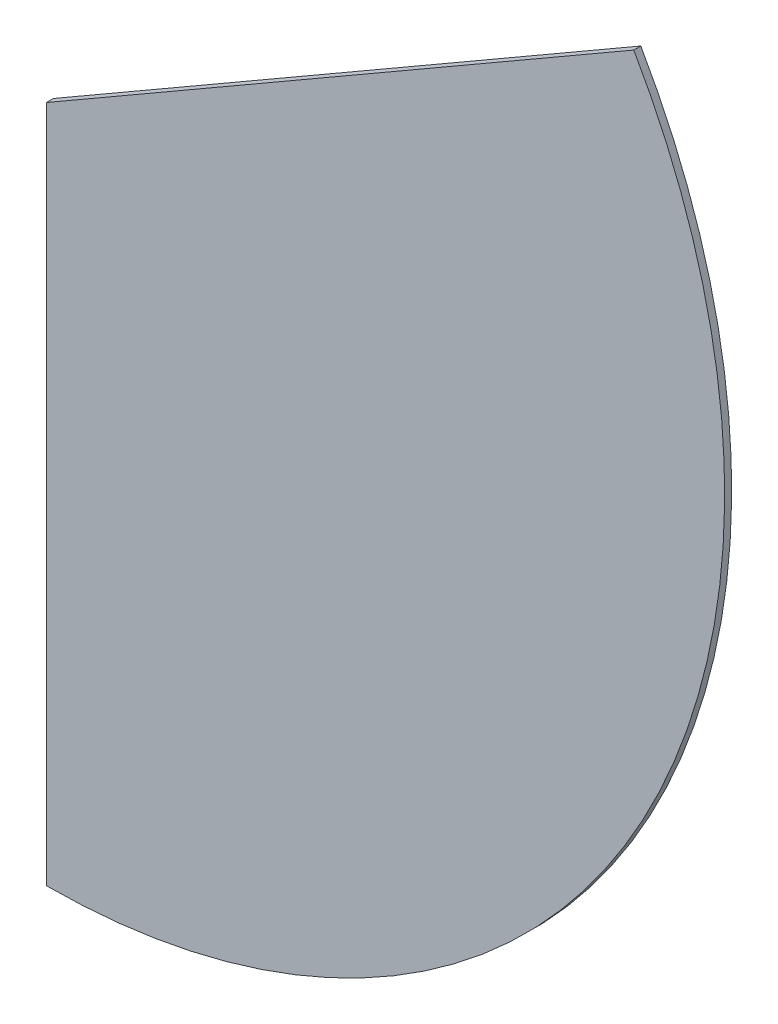
ISO-10303-21;
HEADER;
FILE_DESCRIPTION(('STEP AP214'),'2;1');
FILE_NAME('part.step','',(''),(''),'','','');
FILE_SCHEMA(('AUTOMOTIVE_DESIGN { 1 0 10303 214 1 1 1 1 }'));
ENDSEC;
DATA;
#1=APPLICATION_CONTEXT('core data for automotive mechanical design processes');
#2=APPLICATION_PROTOCOL_DEFINITION('international standard','automotive_design',2000,#1);
#3=PRODUCT_CONTEXT('',#1,'mechanical');
#4=PRODUCT('Part','Part','',(#3));
#5=PRODUCT_RELATED_PRODUCT_CATEGORY('part','',(#4));
#6=PRODUCT_DEFINITION_FORMATION('','',#4);
#7=PRODUCT_DEFINITION_CONTEXT('part definition',#1,'design');
#8=PRODUCT_DEFINITION('design','',#6,#7);
#9=PRODUCT_DEFINITION_SHAPE('','',#8);
#10=(LENGTH_UNIT() NAMED_UNIT(*) SI_UNIT(.MILLI.,.METRE.));
#11=(NAMED_UNIT(*) PLANE_ANGLE_UNIT() SI_UNIT($,.RADIAN.));
#12=(NAMED_UNIT(*) SI_UNIT($,.STERADIAN.) SOLID_ANGLE_UNIT());
#13=UNCERTAINTY_MEASURE_WITH_UNIT(LENGTH_MEASURE(1.E-05),#10,'distance_accuracy_value','');
#14=(GEOMETRIC_REPRESENTATION_CONTEXT(3) GLOBAL_UNCERTAINTY_ASSIGNED_CONTEXT((#13)) GLOBAL_UNIT_ASSIGNED_CONTEXT((#10,
#11,#12)) REPRESENTATION_CONTEXT('',''));
#15=CARTESIAN_POINT('',(0.,0.,0.));
#16=DIRECTION('',(0.,0.,1.));
#17=DIRECTION('',(1.,0.,0.));
#18=AXIS2_PLACEMENT_3D('',#15,#16,#17);
#19=CARTESIAN_POINT('',(0.,0.,1.6));
#20=DIRECTION('',(0.500000000000004,-0.866025403784436,0.));
#21=DIRECTION('',(0.866025403784436,0.500000000000004,0.));
#22=AXIS2_PLACEMENT_3D('',#19,#20,#21);
#23=PLANE('',#22);
#24=DIRECTION('',(-0.866025403784436,-0.500000000000004,0.));
#25=VECTOR('',#24,1.);
#26=CARTESIAN_POINT('',(0.,0.,0.));
#27=LINE('',#26,#25);
#28=CARTESIAN_POINT('',(134.233937586588,77.5000000000007,0.));
#29=VERTEX_POINT('',#28);
#30=CARTESIAN_POINT('',(0.,0.,0.));
#31=VERTEX_POINT('',#30);
#32=EDGE_CURVE('E80',#29,#31,#27,.T.);
#33=ORIENTED_EDGE('',*,*,#32,.T.);
#34=DIRECTION('',(0.,0.,-1.));
#35=VECTOR('',#34,1.);
#36=CARTESIAN_POINT('',(0.,0.,1.6));
#37=LINE('',#36,#35);
#38=CARTESIAN_POINT('',(0.,0.,1.6));
#39=VERTEX_POINT('',#38);
#40=EDGE_CURVE('E11',#39,#31,#37,.T.);
#41=ORIENTED_EDGE('',*,*,#40,.F.);
#42=DIRECTION('',(-0.866025403784436,-0.500000000000004,0.));
#43=VECTOR('',#42,1.);
#44=CARTESIAN_POINT('',(0.,0.,1.6));
#45=LINE('',#44,#43);
#46=CARTESIAN_POINT('',(134.233937586588,77.5000000000007,1.6));
#47=VERTEX_POINT('',#46);
#48=EDGE_CURVE('E73',#47,#39,#45,.T.);
#49=ORIENTED_EDGE('',*,*,#48,.F.);
#50=DIRECTION('',(0.,0.,-1.));
#51=VECTOR('',#50,1.);
#52=CARTESIAN_POINT('',(134.233937586588,77.5000000000007,1.6));
#53=LINE('',#52,#51);
#54=EDGE_CURVE('E81',#47,#29,#53,.T.);
#55=ORIENTED_EDGE('',*,*,#54,.T.);
#56=EDGE_LOOP('',(#33,#41,#49,#55));
#57=FACE_BOUND('',#56,.T.);
#58=ADVANCED_FACE('F33',(#57),#23,.F.);
#59=CARTESIAN_POINT('',(0.,0.,1.6));
#60=DIRECTION('',(1.,0.,0.));
#61=DIRECTION('',(0.,1.,0.));
#62=AXIS2_PLACEMENT_3D('',#59,#60,#61);
#63=PLANE('',#62);
#64=DIRECTION('',(0.,-1.,0.));
#65=VECTOR('',#64,1.);
#66=CARTESIAN_POINT('',(0.,0.,0.));
#67=LINE('',#66,#65);
#68=CARTESIAN_POINT('',(0.,-155.,0.));
#69=VERTEX_POINT('',#68);
#70=EDGE_CURVE('E61',#31,#69,#67,.T.);
#71=ORIENTED_EDGE('',*,*,#70,.T.);
#72=DIRECTION('',(0.,0.,-1.));
#73=VECTOR('',#72,1.);
#74=CARTESIAN_POINT('',(0.,-155.,1.6));
#75=LINE('',#74,#73);
#76=CARTESIAN_POINT('',(0.,-155.,1.6));
#77=VERTEX_POINT('',#76);
#78=EDGE_CURVE('E41',#77,#69,#75,.T.);
#79=ORIENTED_EDGE('',*,*,#78,.F.);
#80=DIRECTION('',(0.,-1.,0.));
#81=VECTOR('',#80,1.);
#82=CARTESIAN_POINT('',(0.,0.,1.6));
#83=LINE('',#82,#81);
#84=EDGE_CURVE('E69',#39,#77,#83,.T.);
#85=ORIENTED_EDGE('',*,*,#84,.F.);
#86=ORIENTED_EDGE('',*,*,#40,.T.);
#87=EDGE_LOOP('',(#71,#79,#85,#86));
#88=FACE_BOUND('',#87,.T.);
#89=ADVANCED_FACE('F70',(#88),#63,.F.);
#90=CARTESIAN_POINT('',(0.,0.,1.6));
#91=DIRECTION('',(0.,0.,-1.));
#92=DIRECTION('',(-1.,0.,0.));
#93=AXIS2_PLACEMENT_3D('',#90,#91,#92);
#94=CYLINDRICAL_SURFACE('',#93,155.);
#95=CARTESIAN_POINT('',(0.,0.,0.));
#96=DIRECTION('',(0.,0.,1.));
#97=DIRECTION('',(-1.,0.,0.));
#98=AXIS2_PLACEMENT_3D('',#95,#96,#97);
#99=CIRCLE('',#98,155.);
#100=EDGE_CURVE('E66',#69,#29,#99,.T.);
#101=ORIENTED_EDGE('',*,*,#100,.T.);
#102=ORIENTED_EDGE('',*,*,#54,.F.);
#103=CARTESIAN_POINT('',(0.,0.,1.6));
#104=DIRECTION('',(0.,0.,1.));
#105=DIRECTION('',(-1.,0.,0.));
#106=AXIS2_PLACEMENT_3D('',#103,#104,#105);
#107=CIRCLE('',#106,155.);
#108=EDGE_CURVE('E49',#77,#47,#107,.T.);
#109=ORIENTED_EDGE('',*,*,#108,.F.);
#110=ORIENTED_EDGE('',*,*,#78,.T.);
#111=EDGE_LOOP('',(#101,#102,#109,#110));
#112=FACE_BOUND('',#111,.T.);
#113=ADVANCED_FACE('F88',(#112),#94,.T.);
#114=CARTESIAN_POINT('',(0.,0.,1.6));
#115=DIRECTION('',(0.,0.,-1.));
#116=DIRECTION('',(-1.,0.,0.));
#117=AXIS2_PLACEMENT_3D('',#114,#115,#116);
#118=PLANE('',#117);
#119=ORIENTED_EDGE('',*,*,#48,.T.);
#120=ORIENTED_EDGE('',*,*,#84,.T.);
#121=ORIENTED_EDGE('',*,*,#108,.T.);
#122=EDGE_LOOP('',(#119,#120,#121));
#123=FACE_BOUND('',#122,.T.);
#124=ADVANCED_FACE('F76',(#123),#118,.F.);
#125=CARTESIAN_POINT('',(0.,0.,0.));
#126=DIRECTION('',(0.,0.,-1.));
#127=DIRECTION('',(-1.,0.,0.));
#128=AXIS2_PLACEMENT_3D('',#125,#126,#127);
#129=PLANE('',#128);
#130=ORIENTED_EDGE('',*,*,#32,.F.);
#131=ORIENTED_EDGE('',*,*,#100,.F.);
#132=ORIENTED_EDGE('',*,*,#70,.F.);
#133=EDGE_LOOP('',(#130,#131,#132));
#134=FACE_BOUND('',#133,.T.);
#135=ADVANCED_FACE('F89',(#134),#129,.T.);
#136=CLOSED_SHELL('',(#58,#89,#113,#124,#135));
#137=MANIFOLD_SOLID_BREP('B2',#136);
#138=ADVANCED_BREP_SHAPE_REPRESENTATION('',(#18,#137),#14);
#139=SHAPE_DEFINITION_REPRESENTATION(#9,#138);
ENDSEC;
END-ISO-10303-21;
